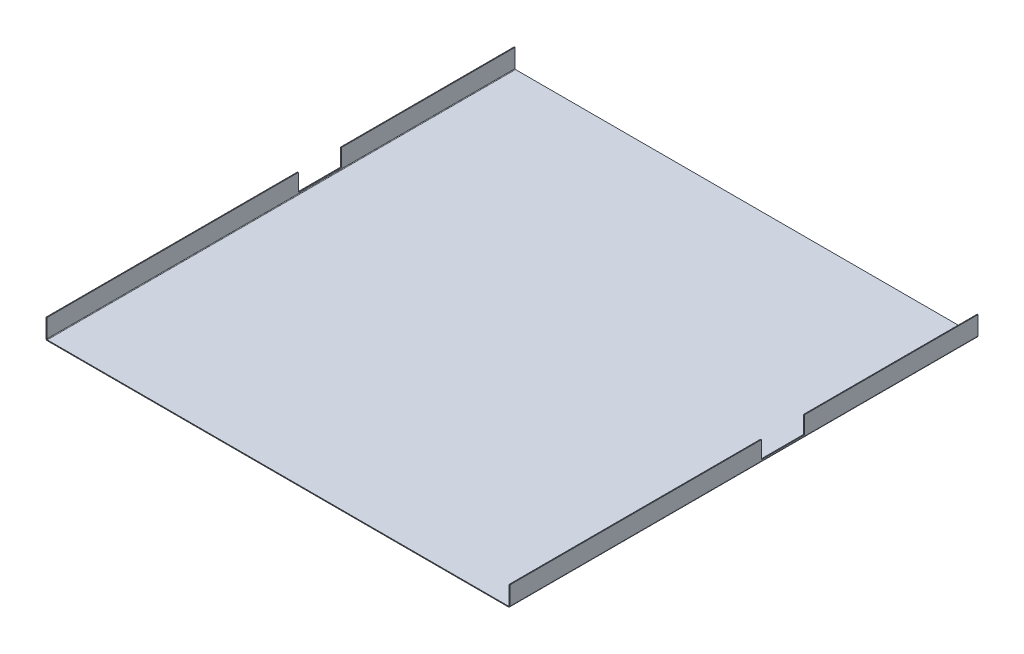
ISO-10303-21;
HEADER;
FILE_DESCRIPTION(('STEP AP214'),'2;1');
FILE_NAME('part.step','',(''),(''),'','','');
FILE_SCHEMA(('AUTOMOTIVE_DESIGN { 1 0 10303 214 1 1 1 1 }'));
ENDSEC;
DATA;
#1=APPLICATION_CONTEXT('core data for automotive mechanical design processes');
#2=APPLICATION_PROTOCOL_DEFINITION('international standard','automotive_design',2000,#1);
#3=PRODUCT_CONTEXT('',#1,'mechanical');
#4=PRODUCT('Part','Part','',(#3));
#5=PRODUCT_RELATED_PRODUCT_CATEGORY('part','',(#4));
#6=PRODUCT_DEFINITION_FORMATION('','',#4);
#7=PRODUCT_DEFINITION_CONTEXT('part definition',#1,'design');
#8=PRODUCT_DEFINITION('design','',#6,#7);
#9=PRODUCT_DEFINITION_SHAPE('','',#8);
#10=(LENGTH_UNIT() NAMED_UNIT(*) SI_UNIT(.MILLI.,.METRE.));
#11=(NAMED_UNIT(*) PLANE_ANGLE_UNIT() SI_UNIT($,.RADIAN.));
#12=(NAMED_UNIT(*) SI_UNIT($,.STERADIAN.) SOLID_ANGLE_UNIT());
#13=UNCERTAINTY_MEASURE_WITH_UNIT(LENGTH_MEASURE(1.E-05),#10,'distance_accuracy_value','');
#14=(GEOMETRIC_REPRESENTATION_CONTEXT(3) GLOBAL_UNCERTAINTY_ASSIGNED_CONTEXT((#13)) GLOBAL_UNIT_ASSIGNED_CONTEXT((#10,
#11,#12)) REPRESENTATION_CONTEXT('',''));
#15=CARTESIAN_POINT('',(0.,0.,0.));
#16=DIRECTION('',(0.,0.,1.));
#17=DIRECTION('',(1.,0.,0.));
#18=AXIS2_PLACEMENT_3D('',#15,#16,#17);
#19=CARTESIAN_POINT('',(-1.75260000000008,24.38,-600.));
#20=DIRECTION('',(0.,-1.,0.));
#21=DIRECTION('',(1.,0.,0.));
#22=AXIS2_PLACEMENT_3D('',#19,#20,#21);
#23=PLANE('',#22);
#24=DIRECTION('',(0.,0.,-1.));
#25=VECTOR('',#24,1.);
#26=CARTESIAN_POINT('',(-1.75260000000008,24.38,0.));
#27=LINE('',#26,#25);
#28=CARTESIAN_POINT('',(-1.7526000000001,24.38,-377.65));
#29=VERTEX_POINT('',#28);
#30=CARTESIAN_POINT('',(-1.75260000000008,24.38,-600.));
#31=VERTEX_POINT('',#30);
#32=EDGE_CURVE('E331',#29,#31,#27,.T.);
#33=ORIENTED_EDGE('',*,*,#32,.F.);
#34=DIRECTION('',(-1.,0.,0.));
#35=VECTOR('',#34,1.);
#36=CARTESIAN_POINT('',(592.5526,24.3800000000021,-377.65));
#37=LINE('',#36,#35);
#38=CARTESIAN_POINT('',(-0.736600000000087,24.38,-377.65));
#39=VERTEX_POINT('',#38);
#40=EDGE_CURVE('E253',#39,#29,#37,.T.);
#41=ORIENTED_EDGE('',*,*,#40,.F.);
#42=DIRECTION('',(0.,0.,1.));
#43=VECTOR('',#42,1.);
#44=CARTESIAN_POINT('',(-0.736600000000083,24.38,-600.));
#45=LINE('',#44,#43);
#46=CARTESIAN_POINT('',(-0.736600000000083,24.38,-600.));
#47=VERTEX_POINT('',#46);
#48=EDGE_CURVE('E340',#39,#47,#45,.F.);
#49=ORIENTED_EDGE('',*,*,#48,.T.);
#50=DIRECTION('',(1.,0.,0.));
#51=VECTOR('',#50,1.);
#52=CARTESIAN_POINT('',(-1.75260000000008,24.38,-600.));
#53=LINE('',#52,#51);
#54=EDGE_CURVE('E322',#31,#47,#53,.T.);
#55=ORIENTED_EDGE('',*,*,#54,.F.);
#56=EDGE_LOOP('',(#33,#41,#49,#55));
#57=FACE_BOUND('',#56,.T.);
#58=ADVANCED_FACE('F85',(#57),#23,.F.);
#59=CARTESIAN_POINT('',(592.5526,24.38,0.));
#60=DIRECTION('',(0.,-1.,0.));
#61=DIRECTION('',(1.,0.,0.));
#62=AXIS2_PLACEMENT_3D('',#59,#60,#61);
#63=PLANE('',#62);
#64=DIRECTION('',(0.,0.,-1.));
#65=VECTOR('',#64,1.);
#66=CARTESIAN_POINT('',(591.5366,24.38,0.));
#67=LINE('',#66,#65);
#68=CARTESIAN_POINT('',(591.5366,24.38,-600.));
#69=VERTEX_POINT('',#68);
#70=CARTESIAN_POINT('',(591.5366,24.3800000000021,-377.65));
#71=VERTEX_POINT('',#70);
#72=EDGE_CURVE('E291',#69,#71,#67,.F.);
#73=ORIENTED_EDGE('',*,*,#72,.T.);
#74=CARTESIAN_POINT('',(592.5526,24.3800000000021,-377.65));
#75=VERTEX_POINT('',#74);
#76=EDGE_CURVE('E251',#75,#71,#37,.T.);
#77=ORIENTED_EDGE('',*,*,#76,.F.);
#78=DIRECTION('',(0.,0.,1.));
#79=VECTOR('',#78,1.);
#80=CARTESIAN_POINT('',(592.5526,24.38,-2.19288513273834E-13));
#81=LINE('',#80,#79);
#82=CARTESIAN_POINT('',(592.5526,24.38,-600.));
#83=VERTEX_POINT('',#82);
#84=EDGE_CURVE('E247',#83,#75,#81,.T.);
#85=ORIENTED_EDGE('',*,*,#84,.F.);
#86=DIRECTION('',(-1.,0.,0.));
#87=VECTOR('',#86,1.);
#88=CARTESIAN_POINT('',(592.5526,24.38,-600.));
#89=LINE('',#88,#87);
#90=EDGE_CURVE('E274',#83,#69,#89,.T.);
#91=ORIENTED_EDGE('',*,*,#90,.T.);
#92=EDGE_LOOP('',(#73,#77,#85,#91));
#93=FACE_BOUND('',#92,.T.);
#94=ADVANCED_FACE('F447',(#93),#63,.F.);
#95=CARTESIAN_POINT('',(0.,-1.016,-600.));
#96=DIRECTION('',(0.,0.,-1.));
#97=DIRECTION('',(-1.,0.,0.));
#98=AXIS2_PLACEMENT_3D('',#95,#96,#97);
#99=PLANE('',#98);
#100=DIRECTION('',(-1.,0.,0.));
#101=VECTOR('',#100,1.);
#102=CARTESIAN_POINT('',(0.,0.,-600.));
#103=LINE('',#102,#101);
#104=CARTESIAN_POINT('',(590.8,0.,-600.));
#105=VERTEX_POINT('',#104);
#106=CARTESIAN_POINT('',(0.,0.,-600.));
#107=VERTEX_POINT('',#106);
#108=EDGE_CURVE('E368',#105,#107,#103,.T.);
#109=ORIENTED_EDGE('',*,*,#108,.F.);
#110=DIRECTION('',(0.,1.,0.));
#111=VECTOR('',#110,1.);
#112=CARTESIAN_POINT('',(590.8,-1.016,-600.));
#113=LINE('',#112,#111);
#114=CARTESIAN_POINT('',(590.8,-1.01600000000011,-600.));
#115=VERTEX_POINT('',#114);
#116=EDGE_CURVE('E388',#115,#105,#113,.T.);
#117=ORIENTED_EDGE('',*,*,#116,.F.);
#118=DIRECTION('',(-1.,0.,0.));
#119=VECTOR('',#118,1.);
#120=CARTESIAN_POINT('',(0.,-1.016,-600.));
#121=LINE('',#120,#119);
#122=CARTESIAN_POINT('',(0.,-1.016,-600.));
#123=VERTEX_POINT('',#122);
#124=EDGE_CURVE('E374',#115,#123,#121,.T.);
#125=ORIENTED_EDGE('',*,*,#124,.T.);
#126=DIRECTION('',(0.,1.,0.));
#127=VECTOR('',#126,1.);
#128=CARTESIAN_POINT('',(0.,-1.016,-600.));
#129=LINE('',#128,#127);
#130=EDGE_CURVE('E93',#123,#107,#129,.T.);
#131=ORIENTED_EDGE('',*,*,#130,.T.);
#132=EDGE_LOOP('',(#109,#117,#125,#131));
#133=FACE_BOUND('',#132,.T.);
#134=ADVANCED_FACE('F453',(#133),#99,.T.);
#135=CARTESIAN_POINT('',(0.,-1.016,0.));
#136=DIRECTION('',(0.,0.,1.));
#137=DIRECTION('',(1.,0.,0.));
#138=AXIS2_PLACEMENT_3D('',#135,#136,#137);
#139=PLANE('',#138);
#140=DIRECTION('',(1.,0.,0.));
#141=VECTOR('',#140,1.);
#142=CARTESIAN_POINT('',(0.,0.,0.));
#143=LINE('',#142,#141);
#144=CARTESIAN_POINT('',(0.,0.,0.));
#145=VERTEX_POINT('',#144);
#146=CARTESIAN_POINT('',(590.8,0.,0.));
#147=VERTEX_POINT('',#146);
#148=EDGE_CURVE('E380',#145,#147,#143,.T.);
#149=ORIENTED_EDGE('',*,*,#148,.F.);
#150=DIRECTION('',(0.,1.,0.));
#151=VECTOR('',#150,1.);
#152=CARTESIAN_POINT('',(0.,-1.016,0.));
#153=LINE('',#152,#151);
#154=CARTESIAN_POINT('',(0.,-1.01599999999998,0.));
#155=VERTEX_POINT('',#154);
#156=EDGE_CURVE('E377',#155,#145,#153,.T.);
#157=ORIENTED_EDGE('',*,*,#156,.F.);
#158=DIRECTION('',(1.,0.,0.));
#159=VECTOR('',#158,1.);
#160=CARTESIAN_POINT('',(0.,-1.016,0.));
#161=LINE('',#160,#159);
#162=CARTESIAN_POINT('',(590.8,-1.016,0.));
#163=VERTEX_POINT('',#162);
#164=EDGE_CURVE('E367',#155,#163,#161,.T.);
#165=ORIENTED_EDGE('',*,*,#164,.T.);
#166=DIRECTION('',(0.,1.,0.));
#167=VECTOR('',#166,1.);
#168=CARTESIAN_POINT('',(590.8,-1.016,0.));
#169=LINE('',#168,#167);
#170=EDGE_CURVE('E391',#163,#147,#169,.T.);
#171=ORIENTED_EDGE('',*,*,#170,.T.);
#172=EDGE_LOOP('',(#149,#157,#165,#171));
#173=FACE_BOUND('',#172,.T.);
#174=ADVANCED_FACE('F87',(#173),#139,.T.);
#175=CARTESIAN_POINT('',(0.,-1.016,0.));
#176=DIRECTION('',(0.,-1.,0.));
#177=DIRECTION('',(0.,0.,-1.));
#178=AXIS2_PLACEMENT_3D('',#175,#176,#177);
#179=PLANE('',#178);
#180=DIRECTION('',(0.,0.,1.));
#181=VECTOR('',#180,1.);
#182=CARTESIAN_POINT('',(0.,-1.016,0.));
#183=LINE('',#182,#181);
#184=EDGE_CURVE('E364',#123,#155,#183,.T.);
#185=ORIENTED_EDGE('',*,*,#184,.F.);
#186=ORIENTED_EDGE('',*,*,#124,.F.);
#187=DIRECTION('',(0.,0.,-1.));
#188=VECTOR('',#187,1.);
#189=CARTESIAN_POINT('',(590.8,-1.016,0.));
#190=LINE('',#189,#188);
#191=EDGE_CURVE('E371',#163,#115,#190,.T.);
#192=ORIENTED_EDGE('',*,*,#191,.F.);
#193=ORIENTED_EDGE('',*,*,#164,.F.);
#194=EDGE_LOOP('',(#185,#186,#192,#193));
#195=FACE_BOUND('',#194,.T.);
#196=ADVANCED_FACE('F496',(#195),#179,.T.);
#197=CARTESIAN_POINT('',(0.,0.,0.));
#198=DIRECTION('',(0.,-1.,0.));
#199=DIRECTION('',(0.,0.,-1.));
#200=AXIS2_PLACEMENT_3D('',#197,#198,#199);
#201=PLANE('',#200);
#202=DIRECTION('',(0.,0.,1.));
#203=VECTOR('',#202,1.);
#204=CARTESIAN_POINT('',(0.,0.,0.));
#205=LINE('',#204,#203);
#206=EDGE_CURVE('E355',#107,#145,#205,.T.);
#207=ORIENTED_EDGE('',*,*,#206,.T.);
#208=ORIENTED_EDGE('',*,*,#148,.T.);
#209=DIRECTION('',(0.,0.,-1.));
#210=VECTOR('',#209,1.);
#211=CARTESIAN_POINT('',(590.8,0.,0.));
#212=LINE('',#211,#210);
#213=EDGE_CURVE('E383',#147,#105,#212,.T.);
#214=ORIENTED_EDGE('',*,*,#213,.T.);
#215=ORIENTED_EDGE('',*,*,#108,.T.);
#216=EDGE_LOOP('',(#207,#208,#214,#215));
#217=FACE_BOUND('',#216,.T.);
#218=ADVANCED_FACE('F492',(#217),#201,.F.);
#219=CARTESIAN_POINT('',(0.,0.7366,-600.));
#220=DIRECTION('',(0.,0.,-1.));
#221=DIRECTION('',(-1.,0.,0.));
#222=AXIS2_PLACEMENT_3D('',#219,#220,#221);
#223=PLANE('',#222);
#224=DIRECTION('',(1.,0.,0.));
#225=VECTOR('',#224,1.);
#226=CARTESIAN_POINT('',(-1.7526,0.736599999999994,-600.));
#227=LINE('',#226,#225);
#228=CARTESIAN_POINT('',(-0.7366,0.736599999999997,-600.));
#229=VERTEX_POINT('',#228);
#230=CARTESIAN_POINT('',(-1.7526,0.736599999999994,-600.));
#231=VERTEX_POINT('',#230);
#232=EDGE_CURVE('E309',#229,#231,#227,.F.);
#233=ORIENTED_EDGE('',*,*,#232,.F.);
#234=CARTESIAN_POINT('',(0.,0.7366,-600.));
#235=DIRECTION('',(0.,0.,1.));
#236=DIRECTION('',(1.,0.,0.));
#237=AXIS2_PLACEMENT_3D('',#234,#235,#236);
#238=CIRCLE('',#237,0.736599999999978);
#239=EDGE_CURVE('E359',#107,#229,#238,.F.);
#240=ORIENTED_EDGE('',*,*,#239,.F.);
#241=ORIENTED_EDGE('',*,*,#130,.F.);
#242=CARTESIAN_POINT('',(0.,0.7366,-600.));
#243=DIRECTION('',(0.,0.,1.));
#244=DIRECTION('',(1.,0.,0.));
#245=AXIS2_PLACEMENT_3D('',#242,#243,#244);
#246=CIRCLE('',#245,1.75259999999998);
#247=EDGE_CURVE('E352',#123,#231,#246,.F.);
#248=ORIENTED_EDGE('',*,*,#247,.T.);
#249=EDGE_LOOP('',(#233,#240,#241,#248));
#250=FACE_BOUND('',#249,.T.);
#251=ADVANCED_FACE('F489',(#250),#223,.T.);
#252=CARTESIAN_POINT('',(0.,0.7366,0.));
#253=DIRECTION('',(0.,0.,-1.));
#254=DIRECTION('',(-1.,0.,0.));
#255=AXIS2_PLACEMENT_3D('',#252,#253,#254);
#256=PLANE('',#255);
#257=CARTESIAN_POINT('',(0.,0.7366,0.));
#258=DIRECTION('',(0.,0.,1.));
#259=DIRECTION('',(1.,0.,0.));
#260=AXIS2_PLACEMENT_3D('',#257,#258,#259);
#261=CIRCLE('',#260,0.736599999999978);
#262=CARTESIAN_POINT('',(-0.736599999999956,0.736599999999997,0.));
#263=VERTEX_POINT('',#262);
#264=EDGE_CURVE('E321',#263,#145,#261,.T.);
#265=ORIENTED_EDGE('',*,*,#264,.F.);
#266=DIRECTION('',(1.,0.,0.));
#267=VECTOR('',#266,1.);
#268=CARTESIAN_POINT('',(-0.7366,0.736599999999997,0.));
#269=LINE('',#268,#267);
#270=CARTESIAN_POINT('',(-1.7526,0.736599999999994,0.));
#271=VERTEX_POINT('',#270);
#272=EDGE_CURVE('E345',#263,#271,#269,.F.);
#273=ORIENTED_EDGE('',*,*,#272,.T.);
#274=CARTESIAN_POINT('',(0.,0.7366,0.));
#275=DIRECTION('',(0.,0.,1.));
#276=DIRECTION('',(1.,0.,0.));
#277=AXIS2_PLACEMENT_3D('',#274,#275,#276);
#278=CIRCLE('',#277,1.75259999999998);
#279=EDGE_CURVE('E356',#271,#155,#278,.T.);
#280=ORIENTED_EDGE('',*,*,#279,.T.);
#281=ORIENTED_EDGE('',*,*,#156,.T.);
#282=EDGE_LOOP('',(#265,#273,#280,#281));
#283=FACE_BOUND('',#282,.T.);
#284=ADVANCED_FACE('F396',(#283),#256,.F.);
#285=CARTESIAN_POINT('',(0.,0.7366,0.));
#286=DIRECTION('',(0.,0.,1.));
#287=DIRECTION('',(-1.,0.,0.));
#288=AXIS2_PLACEMENT_3D('',#285,#286,#287);
#289=CYLINDRICAL_SURFACE('',#288,1.75259999999998);
#290=ORIENTED_EDGE('',*,*,#184,.T.);
#291=ORIENTED_EDGE('',*,*,#279,.F.);
#292=DIRECTION('',(0.,0.,1.));
#293=VECTOR('',#292,1.);
#294=CARTESIAN_POINT('',(-1.7526,0.736599999999994,-600.));
#295=LINE('',#294,#293);
#296=EDGE_CURVE('E343',#271,#231,#295,.F.);
#297=ORIENTED_EDGE('',*,*,#296,.T.);
#298=ORIENTED_EDGE('',*,*,#247,.F.);
#299=EDGE_LOOP('',(#290,#291,#297,#298));
#300=FACE_BOUND('',#299,.T.);
#301=ADVANCED_FACE('F483',(#300),#289,.T.);
#302=CARTESIAN_POINT('',(0.,0.7366,0.));
#303=DIRECTION('',(0.,0.,1.));
#304=DIRECTION('',(-1.,0.,0.));
#305=AXIS2_PLACEMENT_3D('',#302,#303,#304);
#306=CYLINDRICAL_SURFACE('',#305,0.736599999999978);
#307=ORIENTED_EDGE('',*,*,#206,.F.);
#308=ORIENTED_EDGE('',*,*,#239,.T.);
#309=DIRECTION('',(0.,0.,1.));
#310=VECTOR('',#309,1.);
#311=CARTESIAN_POINT('',(-0.7366,0.736599999999997,-600.));
#312=LINE('',#311,#310);
#313=EDGE_CURVE('E348',#229,#263,#312,.T.);
#314=ORIENTED_EDGE('',*,*,#313,.T.);
#315=ORIENTED_EDGE('',*,*,#264,.T.);
#316=EDGE_LOOP('',(#307,#308,#314,#315));
#317=FACE_BOUND('',#316,.T.);
#318=ADVANCED_FACE('F401',(#317),#306,.F.);
#319=CARTESIAN_POINT('',(-1.75260000000008,24.38,0.));
#320=DIRECTION('',(0.,0.,-1.));
#321=DIRECTION('',(-1.,0.,0.));
#322=AXIS2_PLACEMENT_3D('',#319,#320,#321);
#323=PLANE('',#322);
#324=ORIENTED_EDGE('',*,*,#272,.F.);
#325=DIRECTION('',(0.,-1.,0.));
#326=VECTOR('',#325,1.);
#327=CARTESIAN_POINT('',(-0.736600000000083,24.38,0.));
#328=LINE('',#327,#326);
#329=CARTESIAN_POINT('',(-0.736600000000083,24.38,0.));
#330=VERTEX_POINT('',#329);
#331=EDGE_CURVE('E341',#263,#330,#328,.F.);
#332=ORIENTED_EDGE('',*,*,#331,.T.);
#333=DIRECTION('',(1.,0.,0.));
#334=VECTOR('',#333,1.);
#335=CARTESIAN_POINT('',(-1.75260000000008,24.38,0.));
#336=LINE('',#335,#334);
#337=CARTESIAN_POINT('',(-1.75260000000008,24.38,0.));
#338=VERTEX_POINT('',#337);
#339=EDGE_CURVE('E318',#338,#330,#336,.T.);
#340=ORIENTED_EDGE('',*,*,#339,.F.);
#341=DIRECTION('',(0.,1.,0.));
#342=VECTOR('',#341,1.);
#343=CARTESIAN_POINT('',(-1.7526,0.,0.));
#344=LINE('',#343,#342);
#345=EDGE_CURVE('E332',#271,#338,#344,.T.);
#346=ORIENTED_EDGE('',*,*,#345,.F.);
#347=EDGE_LOOP('',(#324,#332,#340,#346));
#348=FACE_BOUND('',#347,.T.);
#349=ADVANCED_FACE('F475',(#348),#323,.F.);
#350=CARTESIAN_POINT('',(-1.7526,0.,-600.));
#351=DIRECTION('',(0.,0.,1.));
#352=DIRECTION('',(1.,0.,0.));
#353=AXIS2_PLACEMENT_3D('',#350,#351,#352);
#354=PLANE('',#353);
#355=ORIENTED_EDGE('',*,*,#232,.T.);
#356=DIRECTION('',(0.,-1.,0.));
#357=VECTOR('',#356,1.);
#358=CARTESIAN_POINT('',(-1.7526,0.,-600.));
#359=LINE('',#358,#357);
#360=EDGE_CURVE('E325',#31,#231,#359,.T.);
#361=ORIENTED_EDGE('',*,*,#360,.F.);
#362=ORIENTED_EDGE('',*,*,#54,.T.);
#363=DIRECTION('',(0.,1.,0.));
#364=VECTOR('',#363,1.);
#365=CARTESIAN_POINT('',(-0.736599999999997,0.,-600.));
#366=LINE('',#365,#364);
#367=EDGE_CURVE('E334',#47,#229,#366,.F.);
#368=ORIENTED_EDGE('',*,*,#367,.T.);
#369=EDGE_LOOP('',(#355,#361,#362,#368));
#370=FACE_BOUND('',#369,.T.);
#371=ADVANCED_FACE('F412',(#370),#354,.F.);
#372=CARTESIAN_POINT('',(-1.7526,0.,0.));
#373=DIRECTION('',(1.,0.,0.));
#374=DIRECTION('',(0.,1.,0.));
#375=AXIS2_PLACEMENT_3D('',#372,#373,#374);
#376=PLANE('',#375);
#377=DIRECTION('',(0.,0.,-1.));
#378=VECTOR('',#377,1.);
#379=CARTESIAN_POINT('',(-1.75260000000001,2.15400000000001,0.));
#380=LINE('',#379,#378);
#381=CARTESIAN_POINT('',(-1.75259999999999,2.15400000000001,-322.35));
#382=VERTEX_POINT('',#381);
#383=CARTESIAN_POINT('',(-1.75259999999999,2.15400000000001,-377.65));
#384=VERTEX_POINT('',#383);
#385=EDGE_CURVE('E270',#382,#384,#380,.T.);
#386=ORIENTED_EDGE('',*,*,#385,.T.);
#387=DIRECTION('',(0.,1.,0.));
#388=VECTOR('',#387,1.);
#389=CARTESIAN_POINT('',(-1.7526,0.,-377.65));
#390=LINE('',#389,#388);
#391=EDGE_CURVE('E265',#384,#29,#390,.T.);
#392=ORIENTED_EDGE('',*,*,#391,.T.);
#393=ORIENTED_EDGE('',*,*,#32,.T.);
#394=ORIENTED_EDGE('',*,*,#360,.T.);
#395=ORIENTED_EDGE('',*,*,#296,.F.);
#396=ORIENTED_EDGE('',*,*,#345,.T.);
#397=CARTESIAN_POINT('',(-1.75260000000008,24.38,-322.35));
#398=VERTEX_POINT('',#397);
#399=EDGE_CURVE('E328',#338,#398,#27,.T.);
#400=ORIENTED_EDGE('',*,*,#399,.T.);
#401=DIRECTION('',(0.,-1.,0.));
#402=VECTOR('',#401,1.);
#403=CARTESIAN_POINT('',(-1.7526,0.,-322.35));
#404=LINE('',#403,#402);
#405=EDGE_CURVE('E100',#398,#382,#404,.T.);
#406=ORIENTED_EDGE('',*,*,#405,.T.);
#407=EDGE_LOOP('',(#386,#392,#393,#394,#395,#396,#400,#406));
#408=FACE_BOUND('',#407,.T.);
#409=ADVANCED_FACE('F428',(#408),#376,.F.);
#410=CARTESIAN_POINT('',(-0.736599999999997,0.,0.));
#411=DIRECTION('',(1.,0.,0.));
#412=DIRECTION('',(0.,1.,0.));
#413=AXIS2_PLACEMENT_3D('',#410,#411,#412);
#414=PLANE('',#413);
#415=DIRECTION('',(0.,1.,0.));
#416=VECTOR('',#415,1.);
#417=CARTESIAN_POINT('',(-0.736599999999997,0.,-377.65));
#418=LINE('',#417,#416);
#419=CARTESIAN_POINT('',(-0.736599999999976,2.15400000000002,-377.65));
#420=VERTEX_POINT('',#419);
#421=EDGE_CURVE('E263',#420,#39,#418,.T.);
#422=ORIENTED_EDGE('',*,*,#421,.F.);
#423=DIRECTION('',(0.,0.,-1.));
#424=VECTOR('',#423,1.);
#425=CARTESIAN_POINT('',(-0.736600000000005,2.15400000000002,0.));
#426=LINE('',#425,#424);
#427=CARTESIAN_POINT('',(-0.736599999999976,2.15400000000002,-322.35));
#428=VERTEX_POINT('',#427);
#429=EDGE_CURVE('E268',#428,#420,#426,.T.);
#430=ORIENTED_EDGE('',*,*,#429,.F.);
#431=DIRECTION('',(0.,-1.,0.));
#432=VECTOR('',#431,1.);
#433=CARTESIAN_POINT('',(-0.736599999999997,0.,-322.35));
#434=LINE('',#433,#432);
#435=CARTESIAN_POINT('',(-0.736600000000087,24.38,-322.35));
#436=VERTEX_POINT('',#435);
#437=EDGE_CURVE('E259',#436,#428,#434,.T.);
#438=ORIENTED_EDGE('',*,*,#437,.F.);
#439=EDGE_CURVE('E337',#330,#436,#45,.F.);
#440=ORIENTED_EDGE('',*,*,#439,.F.);
#441=ORIENTED_EDGE('',*,*,#331,.F.);
#442=ORIENTED_EDGE('',*,*,#313,.F.);
#443=ORIENTED_EDGE('',*,*,#367,.F.);
#444=ORIENTED_EDGE('',*,*,#48,.F.);
#445=EDGE_LOOP('',(#422,#430,#438,#440,#441,#442,#443,#444));
#446=FACE_BOUND('',#445,.T.);
#447=ADVANCED_FACE('F408',(#446),#414,.T.);
#448=ORIENTED_EDGE('',*,*,#439,.T.);
#449=DIRECTION('',(-1.,0.,0.));
#450=VECTOR('',#449,1.);
#451=CARTESIAN_POINT('',(592.5526,24.3800000000021,-322.35));
#452=LINE('',#451,#450);
#453=EDGE_CURVE('E256',#436,#398,#452,.T.);
#454=ORIENTED_EDGE('',*,*,#453,.T.);
#455=ORIENTED_EDGE('',*,*,#399,.F.);
#456=ORIENTED_EDGE('',*,*,#339,.T.);
#457=EDGE_LOOP('',(#448,#454,#455,#456));
#458=FACE_BOUND('',#457,.T.);
#459=ADVANCED_FACE('F434',(#458),#23,.F.);
#460=CARTESIAN_POINT('',(590.8,0.736599999999979,0.));
#461=DIRECTION('',(0.,0.,1.));
#462=DIRECTION('',(1.,0.,0.));
#463=AXIS2_PLACEMENT_3D('',#460,#461,#462);
#464=PLANE('',#463);
#465=DIRECTION('',(-1.,0.,0.));
#466=VECTOR('',#465,1.);
#467=CARTESIAN_POINT('',(592.5526,0.736599999999971,0.));
#468=LINE('',#467,#466);
#469=CARTESIAN_POINT('',(591.5366,0.736599999999976,0.));
#470=VERTEX_POINT('',#469);
#471=CARTESIAN_POINT('',(592.5526,0.736599999999971,0.));
#472=VERTEX_POINT('',#471);
#473=EDGE_CURVE('E273',#470,#472,#468,.F.);
#474=ORIENTED_EDGE('',*,*,#473,.F.);
#475=CARTESIAN_POINT('',(590.8,0.736599999999979,0.));
#476=DIRECTION('',(0.,0.,-1.));
#477=DIRECTION('',(-1.,0.,0.));
#478=AXIS2_PLACEMENT_3D('',#475,#476,#477);
#479=CIRCLE('',#478,0.736600000000087);
#480=EDGE_CURVE('E313',#147,#470,#479,.F.);
#481=ORIENTED_EDGE('',*,*,#480,.F.);
#482=ORIENTED_EDGE('',*,*,#170,.F.);
#483=CARTESIAN_POINT('',(590.8,0.736599999999979,0.));
#484=DIRECTION('',(0.,0.,-1.));
#485=DIRECTION('',(-1.,0.,0.));
#486=AXIS2_PLACEMENT_3D('',#483,#484,#485);
#487=CIRCLE('',#486,1.75260000000009);
#488=EDGE_CURVE('E306',#163,#472,#487,.F.);
#489=ORIENTED_EDGE('',*,*,#488,.T.);
#490=EDGE_LOOP('',(#474,#481,#482,#489));
#491=FACE_BOUND('',#490,.T.);
#492=ADVANCED_FACE('F459',(#491),#464,.T.);
#493=CARTESIAN_POINT('',(590.8,0.736599999999979,-600.));
#494=DIRECTION('',(0.,0.,1.));
#495=DIRECTION('',(1.,0.,0.));
#496=AXIS2_PLACEMENT_3D('',#493,#494,#495);
#497=PLANE('',#496);
#498=CARTESIAN_POINT('',(590.8,0.736599999999979,-600.));
#499=DIRECTION('',(0.,0.,-1.));
#500=DIRECTION('',(-1.,0.,0.));
#501=AXIS2_PLACEMENT_3D('',#498,#499,#500);
#502=CIRCLE('',#501,0.736600000000087);
#503=CARTESIAN_POINT('',(591.5366,0.736599999999976,-600.));
#504=VERTEX_POINT('',#503);
#505=EDGE_CURVE('E277',#504,#105,#502,.T.);
#506=ORIENTED_EDGE('',*,*,#505,.F.);
#507=DIRECTION('',(-1.,0.,0.));
#508=VECTOR('',#507,1.);
#509=CARTESIAN_POINT('',(591.5366,0.736599999999976,-600.));
#510=LINE('',#509,#508);
#511=CARTESIAN_POINT('',(592.5526,0.736599999999971,-600.));
#512=VERTEX_POINT('',#511);
#513=EDGE_CURVE('E299',#504,#512,#510,.F.);
#514=ORIENTED_EDGE('',*,*,#513,.T.);
#515=CARTESIAN_POINT('',(590.8,0.736599999999979,-600.));
#516=DIRECTION('',(0.,0.,-1.));
#517=DIRECTION('',(-1.,0.,0.));
#518=AXIS2_PLACEMENT_3D('',#515,#516,#517);
#519=CIRCLE('',#518,1.75260000000009);
#520=EDGE_CURVE('E310',#512,#115,#519,.T.);
#521=ORIENTED_EDGE('',*,*,#520,.T.);
#522=ORIENTED_EDGE('',*,*,#116,.T.);
#523=EDGE_LOOP('',(#506,#514,#521,#522));
#524=FACE_BOUND('',#523,.T.);
#525=ADVANCED_FACE('F465',(#524),#497,.F.);
#526=CARTESIAN_POINT('',(590.8,0.736599999999979,-600.));
#527=DIRECTION('',(0.,0.,-1.));
#528=DIRECTION('',(1.,0.,0.));
#529=AXIS2_PLACEMENT_3D('',#526,#527,#528);
#530=CYLINDRICAL_SURFACE('',#529,1.75260000000009);
#531=ORIENTED_EDGE('',*,*,#191,.T.);
#532=ORIENTED_EDGE('',*,*,#520,.F.);
#533=DIRECTION('',(0.,0.,-1.));
#534=VECTOR('',#533,1.);
#535=CARTESIAN_POINT('',(592.5526,0.736599999999971,0.));
#536=LINE('',#535,#534);
#537=EDGE_CURVE('E297',#512,#472,#536,.F.);
#538=ORIENTED_EDGE('',*,*,#537,.T.);
#539=ORIENTED_EDGE('',*,*,#488,.F.);
#540=EDGE_LOOP('',(#531,#532,#538,#539));
#541=FACE_BOUND('',#540,.T.);
#542=ADVANCED_FACE('F543',(#541),#530,.T.);
#543=CARTESIAN_POINT('',(590.8,0.736599999999979,-600.));
#544=DIRECTION('',(0.,0.,-1.));
#545=DIRECTION('',(1.,0.,0.));
#546=AXIS2_PLACEMENT_3D('',#543,#544,#545);
#547=CYLINDRICAL_SURFACE('',#546,0.736600000000087);
#548=ORIENTED_EDGE('',*,*,#213,.F.);
#549=ORIENTED_EDGE('',*,*,#480,.T.);
#550=DIRECTION('',(0.,0.,-1.));
#551=VECTOR('',#550,1.);
#552=CARTESIAN_POINT('',(591.5366,0.736599999999976,0.));
#553=LINE('',#552,#551);
#554=EDGE_CURVE('E302',#470,#504,#553,.T.);
#555=ORIENTED_EDGE('',*,*,#554,.T.);
#556=ORIENTED_EDGE('',*,*,#505,.T.);
#557=EDGE_LOOP('',(#548,#549,#555,#556));
#558=FACE_BOUND('',#557,.T.);
#559=ADVANCED_FACE('F515',(#558),#547,.F.);
#560=CARTESIAN_POINT('',(592.5526,24.38,-600.));
#561=DIRECTION('',(0.,0.,1.));
#562=DIRECTION('',(1.,0.,0.));
#563=AXIS2_PLACEMENT_3D('',#560,#561,#562);
#564=PLANE('',#563);
#565=ORIENTED_EDGE('',*,*,#513,.F.);
#566=DIRECTION('',(0.,-1.,0.));
#567=VECTOR('',#566,1.);
#568=CARTESIAN_POINT('',(591.5366,24.38,-600.));
#569=LINE('',#568,#567);
#570=EDGE_CURVE('E295',#504,#69,#569,.F.);
#571=ORIENTED_EDGE('',*,*,#570,.T.);
#572=ORIENTED_EDGE('',*,*,#90,.F.);
#573=DIRECTION('',(0.,1.,0.));
#574=VECTOR('',#573,1.);
#575=CARTESIAN_POINT('',(592.5526,-2.69394834154782E-12,-600.));
#576=LINE('',#575,#574);
#577=EDGE_CURVE('E286',#512,#83,#576,.T.);
#578=ORIENTED_EDGE('',*,*,#577,.F.);
#579=EDGE_LOOP('',(#565,#571,#572,#578));
#580=FACE_BOUND('',#579,.T.);
#581=ADVANCED_FACE('F536',(#580),#564,.F.);
#582=CARTESIAN_POINT('',(592.5526,0.,0.));
#583=DIRECTION('',(0.,0.,-1.));
#584=DIRECTION('',(-1.,0.,0.));
#585=AXIS2_PLACEMENT_3D('',#582,#583,#584);
#586=PLANE('',#585);
#587=ORIENTED_EDGE('',*,*,#473,.T.);
#588=DIRECTION('',(0.,-1.,0.));
#589=VECTOR('',#588,1.);
#590=CARTESIAN_POINT('',(592.5526,-2.69394834154782E-12,0.));
#591=LINE('',#590,#589);
#592=CARTESIAN_POINT('',(592.5526,24.38,0.));
#593=VERTEX_POINT('',#592);
#594=EDGE_CURVE('E281',#593,#472,#591,.T.);
#595=ORIENTED_EDGE('',*,*,#594,.F.);
#596=DIRECTION('',(-1.,0.,0.));
#597=VECTOR('',#596,1.);
#598=CARTESIAN_POINT('',(592.5526,24.38,0.));
#599=LINE('',#598,#597);
#600=CARTESIAN_POINT('',(591.5366,24.38,0.));
#601=VERTEX_POINT('',#600);
#602=EDGE_CURVE('E278',#593,#601,#599,.T.);
#603=ORIENTED_EDGE('',*,*,#602,.T.);
#604=DIRECTION('',(0.,1.,0.));
#605=VECTOR('',#604,1.);
#606=CARTESIAN_POINT('',(591.5366,0.,0.));
#607=LINE('',#606,#605);
#608=EDGE_CURVE('E288',#601,#470,#607,.F.);
#609=ORIENTED_EDGE('',*,*,#608,.T.);
#610=EDGE_LOOP('',(#587,#595,#603,#609));
#611=FACE_BOUND('',#610,.T.);
#612=ADVANCED_FACE('F525',(#611),#586,.F.);
#613=CARTESIAN_POINT('',(592.5526,-2.69394834154782E-12,-2.19288513273834E-13));
#614=DIRECTION('',(-1.,0.,0.));
#615=DIRECTION('',(0.,-1.,0.));
#616=AXIS2_PLACEMENT_3D('',#613,#614,#615);
#617=PLANE('',#616);
#618=ORIENTED_EDGE('',*,*,#84,.T.);
#619=DIRECTION('',(0.,-1.,0.));
#620=VECTOR('',#619,1.);
#621=CARTESIAN_POINT('',(592.5526,24.3800000000021,-377.65));
#622=LINE('',#621,#620);
#623=CARTESIAN_POINT('',(592.5526,2.15400000000209,-377.65));
#624=VERTEX_POINT('',#623);
#625=EDGE_CURVE('E226',#75,#624,#622,.T.);
#626=ORIENTED_EDGE('',*,*,#625,.T.);
#627=DIRECTION('',(0.,0.,1.));
#628=VECTOR('',#627,1.);
#629=CARTESIAN_POINT('',(592.5526,2.15400000000209,-377.65));
#630=LINE('',#629,#628);
#631=CARTESIAN_POINT('',(592.5526,2.15400000000209,-322.35));
#632=VERTEX_POINT('',#631);
#633=EDGE_CURVE('E236',#624,#632,#630,.T.);
#634=ORIENTED_EDGE('',*,*,#633,.T.);
#635=DIRECTION('',(0.,1.,0.));
#636=VECTOR('',#635,1.);
#637=CARTESIAN_POINT('',(592.5526,24.3800000000021,-322.35));
#638=LINE('',#637,#636);
#639=CARTESIAN_POINT('',(592.5526,24.3800000000021,-322.35));
#640=VERTEX_POINT('',#639);
#641=EDGE_CURVE('E242',#632,#640,#638,.T.);
#642=ORIENTED_EDGE('',*,*,#641,.T.);
#643=EDGE_CURVE('E285',#640,#593,#81,.T.);
#644=ORIENTED_EDGE('',*,*,#643,.T.);
#645=ORIENTED_EDGE('',*,*,#594,.T.);
#646=ORIENTED_EDGE('',*,*,#537,.F.);
#647=ORIENTED_EDGE('',*,*,#577,.T.);
#648=EDGE_LOOP('',(#618,#626,#634,#642,#644,#645,#646,#647));
#649=FACE_BOUND('',#648,.T.);
#650=ADVANCED_FACE('F245',(#649),#617,.F.);
#651=CARTESIAN_POINT('',(591.5366,-2.69040099650756E-12,-2.18912517742827E-13));
#652=DIRECTION('',(-1.,0.,0.));
#653=DIRECTION('',(0.,-1.,0.));
#654=AXIS2_PLACEMENT_3D('',#651,#652,#653);
#655=PLANE('',#654);
#656=DIRECTION('',(0.,-1.,0.));
#657=VECTOR('',#656,1.);
#658=CARTESIAN_POINT('',(591.5366,-2.69040099650756E-12,-377.65));
#659=LINE('',#658,#657);
#660=CARTESIAN_POINT('',(591.5366,2.15400000000208,-377.65));
#661=VERTEX_POINT('',#660);
#662=EDGE_CURVE('E229',#71,#661,#659,.T.);
#663=ORIENTED_EDGE('',*,*,#662,.F.);
#664=ORIENTED_EDGE('',*,*,#72,.F.);
#665=ORIENTED_EDGE('',*,*,#570,.F.);
#666=ORIENTED_EDGE('',*,*,#554,.F.);
#667=ORIENTED_EDGE('',*,*,#608,.F.);
#668=CARTESIAN_POINT('',(591.5366,24.38,-322.35));
#669=VERTEX_POINT('',#668);
#670=EDGE_CURVE('E294',#669,#601,#67,.F.);
#671=ORIENTED_EDGE('',*,*,#670,.F.);
#672=DIRECTION('',(0.,1.,0.));
#673=VECTOR('',#672,1.);
#674=CARTESIAN_POINT('',(591.5366,-2.69040099650756E-12,-322.35));
#675=LINE('',#674,#673);
#676=CARTESIAN_POINT('',(591.5366,2.15400000000208,-322.35));
#677=VERTEX_POINT('',#676);
#678=EDGE_CURVE('E108',#677,#669,#675,.T.);
#679=ORIENTED_EDGE('',*,*,#678,.F.);
#680=DIRECTION('',(0.,0.,1.));
#681=VECTOR('',#680,1.);
#682=CARTESIAN_POINT('',(591.5366,2.15400000000208,-2.18912517742827E-13));
#683=LINE('',#682,#681);
#684=EDGE_CURVE('E13',#661,#677,#683,.T.);
#685=ORIENTED_EDGE('',*,*,#684,.F.);
#686=EDGE_LOOP('',(#663,#664,#665,#666,#667,#671,#679,#685));
#687=FACE_BOUND('',#686,.T.);
#688=ADVANCED_FACE('F521',(#687),#655,.T.);
#689=ORIENTED_EDGE('',*,*,#643,.F.);
#690=EDGE_CURVE('E254',#640,#669,#452,.T.);
#691=ORIENTED_EDGE('',*,*,#690,.T.);
#692=ORIENTED_EDGE('',*,*,#670,.T.);
#693=ORIENTED_EDGE('',*,*,#602,.F.);
#694=EDGE_LOOP('',(#689,#691,#692,#693));
#695=FACE_BOUND('',#694,.T.);
#696=ADVANCED_FACE('F445',(#695),#63,.F.);
#697=CARTESIAN_POINT('',(592.5526,24.3800000000021,-322.35));
#698=DIRECTION('',(0.,0.,1.));
#699=DIRECTION('',(1.,0.,0.));
#700=AXIS2_PLACEMENT_3D('',#697,#698,#699);
#701=PLANE('',#700);
#702=ORIENTED_EDGE('',*,*,#678,.T.);
#703=ORIENTED_EDGE('',*,*,#690,.F.);
#704=ORIENTED_EDGE('',*,*,#641,.F.);
#705=DIRECTION('',(-1.,0.,0.));
#706=VECTOR('',#705,1.);
#707=CARTESIAN_POINT('',(592.5526,2.15400000000209,-322.35));
#708=LINE('',#707,#706);
#709=EDGE_CURVE('E238',#632,#677,#708,.T.);
#710=ORIENTED_EDGE('',*,*,#709,.T.);
#711=EDGE_LOOP('',(#702,#703,#704,#710));
#712=FACE_BOUND('',#711,.T.);
#713=ADVANCED_FACE('F438',(#712),#701,.F.);
#714=CARTESIAN_POINT('',(592.5526,24.3800000000021,-377.65));
#715=DIRECTION('',(0.,0.,-1.));
#716=DIRECTION('',(-1.,0.,0.));
#717=AXIS2_PLACEMENT_3D('',#714,#715,#716);
#718=PLANE('',#717);
#719=ORIENTED_EDGE('',*,*,#662,.T.);
#720=DIRECTION('',(-1.,0.,0.));
#721=VECTOR('',#720,1.);
#722=CARTESIAN_POINT('',(592.5526,2.15400000000209,-377.65));
#723=LINE('',#722,#721);
#724=EDGE_CURVE('E222',#624,#661,#723,.T.);
#725=ORIENTED_EDGE('',*,*,#724,.F.);
#726=ORIENTED_EDGE('',*,*,#625,.F.);
#727=ORIENTED_EDGE('',*,*,#76,.T.);
#728=EDGE_LOOP('',(#719,#725,#726,#727));
#729=FACE_BOUND('',#728,.T.);
#730=ADVANCED_FACE('F224',(#729),#718,.F.);
#731=CARTESIAN_POINT('',(592.5526,2.15400000000209,-377.65));
#732=DIRECTION('',(0.,-1.,0.));
#733=DIRECTION('',(1.,0.,0.));
#734=AXIS2_PLACEMENT_3D('',#731,#732,#733);
#735=PLANE('',#734);
#736=ORIENTED_EDGE('',*,*,#684,.T.);
#737=ORIENTED_EDGE('',*,*,#709,.F.);
#738=ORIENTED_EDGE('',*,*,#633,.F.);
#739=ORIENTED_EDGE('',*,*,#724,.T.);
#740=EDGE_LOOP('',(#736,#737,#738,#739));
#741=FACE_BOUND('',#740,.T.);
#742=ADVANCED_FACE('F237',(#741),#735,.F.);
#743=EDGE_CURVE('E232',#428,#382,#708,.T.);
#744=ORIENTED_EDGE('',*,*,#743,.F.);
#745=ORIENTED_EDGE('',*,*,#429,.T.);
#746=EDGE_CURVE('E233',#420,#384,#723,.T.);
#747=ORIENTED_EDGE('',*,*,#746,.T.);
#748=ORIENTED_EDGE('',*,*,#385,.F.);
#749=EDGE_LOOP('',(#744,#745,#747,#748));
#750=FACE_BOUND('',#749,.T.);
#751=ADVANCED_FACE('F426',(#750),#735,.F.);
#752=ORIENTED_EDGE('',*,*,#746,.F.);
#753=ORIENTED_EDGE('',*,*,#421,.T.);
#754=ORIENTED_EDGE('',*,*,#40,.T.);
#755=ORIENTED_EDGE('',*,*,#391,.F.);
#756=EDGE_LOOP('',(#752,#753,#754,#755));
#757=FACE_BOUND('',#756,.T.);
#758=ADVANCED_FACE('F422',(#757),#718,.F.);
#759=ORIENTED_EDGE('',*,*,#453,.F.);
#760=ORIENTED_EDGE('',*,*,#437,.T.);
#761=ORIENTED_EDGE('',*,*,#743,.T.);
#762=ORIENTED_EDGE('',*,*,#405,.F.);
#763=EDGE_LOOP('',(#759,#760,#761,#762));
#764=FACE_BOUND('',#763,.T.);
#765=ADVANCED_FACE('F435',(#764),#701,.F.);
#766=CLOSED_SHELL('',(#58,#94,#134,#174,#196,#218,#251,#284,#301,#318,#349,#371,#409,#447,#459,
#492,#525,#542,#559,#581,#612,#650,#688,#696,#713,#730,#742,#751,#758,#765));
#767=MANIFOLD_SOLID_BREP('B2',#766);
#768=ADVANCED_BREP_SHAPE_REPRESENTATION('',(#18,#767),#14);
#769=SHAPE_DEFINITION_REPRESENTATION(#9,#768);
ENDSEC;
END-ISO-10303-21;
